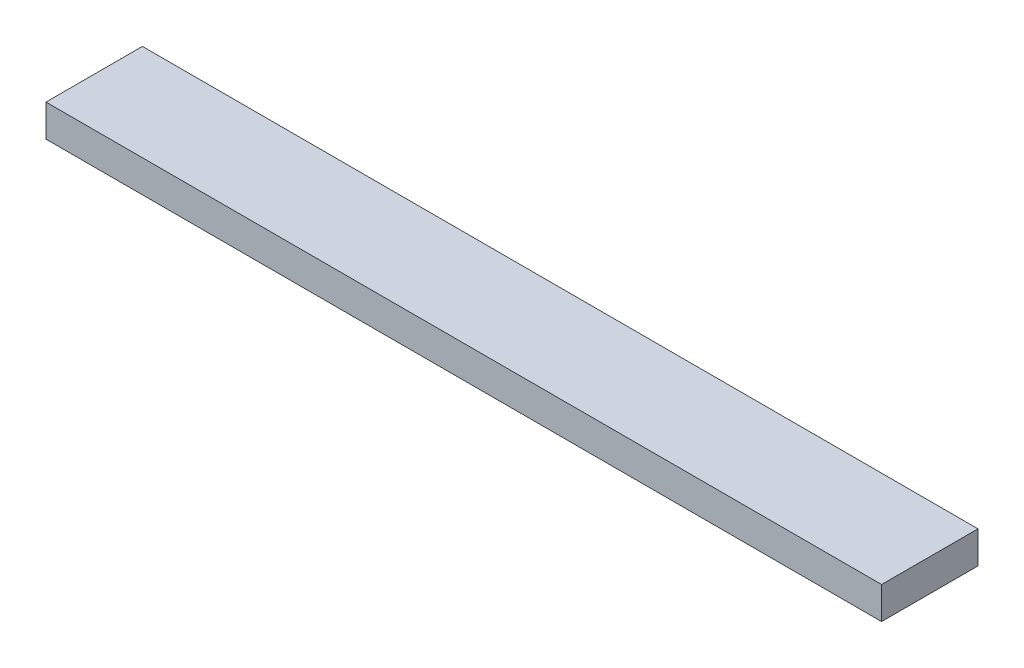
ISO-10303-21;
HEADER;
FILE_DESCRIPTION(('STEP AP214'),'2;1');
FILE_NAME('part.step','',(''),(''),'','','');
FILE_SCHEMA(('AUTOMOTIVE_DESIGN { 1 0 10303 214 1 1 1 1 }'));
ENDSEC;
DATA;
#1=APPLICATION_CONTEXT('core data for automotive mechanical design processes');
#2=APPLICATION_PROTOCOL_DEFINITION('international standard','automotive_design',2000,#1);
#3=PRODUCT_CONTEXT('',#1,'mechanical');
#4=PRODUCT('Part','Part','',(#3));
#5=PRODUCT_RELATED_PRODUCT_CATEGORY('part','',(#4));
#6=PRODUCT_DEFINITION_FORMATION('','',#4);
#7=PRODUCT_DEFINITION_CONTEXT('part definition',#1,'design');
#8=PRODUCT_DEFINITION('design','',#6,#7);
#9=PRODUCT_DEFINITION_SHAPE('','',#8);
#10=(LENGTH_UNIT() NAMED_UNIT(*) SI_UNIT(.MILLI.,.METRE.));
#11=(NAMED_UNIT(*) PLANE_ANGLE_UNIT() SI_UNIT($,.RADIAN.));
#12=(NAMED_UNIT(*) SI_UNIT($,.STERADIAN.) SOLID_ANGLE_UNIT());
#13=UNCERTAINTY_MEASURE_WITH_UNIT(LENGTH_MEASURE(1.E-05),#10,'distance_accuracy_value','');
#14=(GEOMETRIC_REPRESENTATION_CONTEXT(3) GLOBAL_UNCERTAINTY_ASSIGNED_CONTEXT((#13)) GLOBAL_UNIT_ASSIGNED_CONTEXT((#10,
#11,#12)) REPRESENTATION_CONTEXT('',''));
#15=CARTESIAN_POINT('',(0.,0.,0.));
#16=DIRECTION('',(0.,0.,1.));
#17=DIRECTION('',(1.,0.,0.));
#18=AXIS2_PLACEMENT_3D('',#15,#16,#17);
#19=CARTESIAN_POINT('',(82.55,3.175,-9.525));
#20=DIRECTION('',(0.,0.,1.));
#21=DIRECTION('',(1.,0.,0.));
#22=AXIS2_PLACEMENT_3D('',#19,#20,#21);
#23=PLANE('',#22);
#24=DIRECTION('',(0.,1.,0.));
#25=VECTOR('',#24,1.);
#26=CARTESIAN_POINT('',(-82.55,3.175,-9.525));
#27=LINE('',#26,#25);
#28=CARTESIAN_POINT('',(-82.55,-3.175,-9.525));
#29=VERTEX_POINT('',#28);
#30=CARTESIAN_POINT('',(-82.55,3.175,-9.525));
#31=VERTEX_POINT('',#30);
#32=EDGE_CURVE('E107',#29,#31,#27,.T.);
#33=ORIENTED_EDGE('',*,*,#32,.T.);
#34=DIRECTION('',(-1.,0.,0.));
#35=VECTOR('',#34,1.);
#36=CARTESIAN_POINT('',(82.55,3.175,-9.525));
#37=LINE('',#36,#35);
#38=CARTESIAN_POINT('',(82.55,3.175,-9.525));
#39=VERTEX_POINT('',#38);
#40=EDGE_CURVE('E11',#39,#31,#37,.T.);
#41=ORIENTED_EDGE('',*,*,#40,.F.);
#42=DIRECTION('',(0.,1.,0.));
#43=VECTOR('',#42,1.);
#44=CARTESIAN_POINT('',(82.55,3.175,-9.525));
#45=LINE('',#44,#43);
#46=CARTESIAN_POINT('',(82.55,-3.175,-9.525));
#47=VERTEX_POINT('',#46);
#48=EDGE_CURVE('E90',#47,#39,#45,.T.);
#49=ORIENTED_EDGE('',*,*,#48,.F.);
#50=DIRECTION('',(-1.,0.,0.));
#51=VECTOR('',#50,1.);
#52=CARTESIAN_POINT('',(82.55,-3.175,-9.525));
#53=LINE('',#52,#51);
#54=EDGE_CURVE('E103',#47,#29,#53,.T.);
#55=ORIENTED_EDGE('',*,*,#54,.T.);
#56=EDGE_LOOP('',(#33,#41,#49,#55));
#57=FACE_BOUND('',#56,.T.);
#58=ADVANCED_FACE('F38',(#57),#23,.F.);
#59=CARTESIAN_POINT('',(82.55,3.175,9.525));
#60=DIRECTION('',(0.,-1.,0.));
#61=DIRECTION('',(0.,0.,-1.));
#62=AXIS2_PLACEMENT_3D('',#59,#60,#61);
#63=PLANE('',#62);
#64=DIRECTION('',(0.,0.,1.));
#65=VECTOR('',#64,1.);
#66=CARTESIAN_POINT('',(-82.55,3.175,9.525));
#67=LINE('',#66,#65);
#68=CARTESIAN_POINT('',(-82.55,3.175,9.525));
#69=VERTEX_POINT('',#68);
#70=EDGE_CURVE('E95',#31,#69,#67,.T.);
#71=ORIENTED_EDGE('',*,*,#70,.T.);
#72=DIRECTION('',(-1.,0.,0.));
#73=VECTOR('',#72,1.);
#74=CARTESIAN_POINT('',(82.55,3.175,9.525));
#75=LINE('',#74,#73);
#76=CARTESIAN_POINT('',(82.55,3.175,9.525));
#77=VERTEX_POINT('',#76);
#78=EDGE_CURVE('E47',#77,#69,#75,.T.);
#79=ORIENTED_EDGE('',*,*,#78,.F.);
#80=DIRECTION('',(0.,0.,1.));
#81=VECTOR('',#80,1.);
#82=CARTESIAN_POINT('',(82.55,3.175,9.525));
#83=LINE('',#82,#81);
#84=EDGE_CURVE('E85',#39,#77,#83,.T.);
#85=ORIENTED_EDGE('',*,*,#84,.F.);
#86=ORIENTED_EDGE('',*,*,#40,.T.);
#87=EDGE_LOOP('',(#71,#79,#85,#86));
#88=FACE_BOUND('',#87,.T.);
#89=ADVANCED_FACE('F94',(#88),#63,.F.);
#90=CARTESIAN_POINT('',(82.55,3.175,9.525));
#91=DIRECTION('',(0.,0.,-1.));
#92=DIRECTION('',(-1.,0.,0.));
#93=AXIS2_PLACEMENT_3D('',#90,#91,#92);
#94=PLANE('',#93);
#95=DIRECTION('',(0.,-1.,0.));
#96=VECTOR('',#95,1.);
#97=CARTESIAN_POINT('',(-82.55,3.175,9.525));
#98=LINE('',#97,#96);
#99=CARTESIAN_POINT('',(-82.55,-3.175,9.525));
#100=VERTEX_POINT('',#99);
#101=EDGE_CURVE('E72',#69,#100,#98,.T.);
#102=ORIENTED_EDGE('',*,*,#101,.T.);
#103=DIRECTION('',(-1.,0.,0.));
#104=VECTOR('',#103,1.);
#105=CARTESIAN_POINT('',(82.55,-3.175,9.525));
#106=LINE('',#105,#104);
#107=CARTESIAN_POINT('',(82.55,-3.175,9.525));
#108=VERTEX_POINT('',#107);
#109=EDGE_CURVE('E97',#108,#100,#106,.T.);
#110=ORIENTED_EDGE('',*,*,#109,.F.);
#111=DIRECTION('',(0.,-1.,0.));
#112=VECTOR('',#111,1.);
#113=CARTESIAN_POINT('',(82.55,3.175,9.525));
#114=LINE('',#113,#112);
#115=EDGE_CURVE('E88',#77,#108,#114,.T.);
#116=ORIENTED_EDGE('',*,*,#115,.F.);
#117=ORIENTED_EDGE('',*,*,#78,.T.);
#118=EDGE_LOOP('',(#102,#110,#116,#117));
#119=FACE_BOUND('',#118,.T.);
#120=ADVANCED_FACE('F98',(#119),#94,.F.);
#121=CARTESIAN_POINT('',(82.55,-3.175,9.525));
#122=DIRECTION('',(0.,1.,0.));
#123=DIRECTION('',(0.,0.,1.));
#124=AXIS2_PLACEMENT_3D('',#121,#122,#123);
#125=PLANE('',#124);
#126=DIRECTION('',(0.,0.,-1.));
#127=VECTOR('',#126,1.);
#128=CARTESIAN_POINT('',(-82.55,-3.175,9.525));
#129=LINE('',#128,#127);
#130=EDGE_CURVE('E78',#100,#29,#129,.T.);
#131=ORIENTED_EDGE('',*,*,#130,.T.);
#132=ORIENTED_EDGE('',*,*,#54,.F.);
#133=DIRECTION('',(0.,0.,-1.));
#134=VECTOR('',#133,1.);
#135=CARTESIAN_POINT('',(82.55,-3.175,9.525));
#136=LINE('',#135,#134);
#137=EDGE_CURVE('E55',#108,#47,#136,.T.);
#138=ORIENTED_EDGE('',*,*,#137,.F.);
#139=ORIENTED_EDGE('',*,*,#109,.T.);
#140=EDGE_LOOP('',(#131,#132,#138,#139));
#141=FACE_BOUND('',#140,.T.);
#142=ADVANCED_FACE('F121',(#141),#125,.F.);
#143=CARTESIAN_POINT('',(82.55,0.,0.));
#144=DIRECTION('',(1.,0.,0.));
#145=DIRECTION('',(0.,0.,-1.));
#146=AXIS2_PLACEMENT_3D('',#143,#144,#145);
#147=PLANE('',#146);
#148=ORIENTED_EDGE('',*,*,#48,.T.);
#149=ORIENTED_EDGE('',*,*,#84,.T.);
#150=ORIENTED_EDGE('',*,*,#115,.T.);
#151=ORIENTED_EDGE('',*,*,#137,.T.);
#152=EDGE_LOOP('',(#148,#149,#150,#151));
#153=FACE_BOUND('',#152,.T.);
#154=ADVANCED_FACE('F86',(#153),#147,.T.);
#155=CARTESIAN_POINT('',(-82.55,0.,0.));
#156=DIRECTION('',(1.,0.,0.));
#157=DIRECTION('',(0.,0.,-1.));
#158=AXIS2_PLACEMENT_3D('',#155,#156,#157);
#159=PLANE('',#158);
#160=ORIENTED_EDGE('',*,*,#32,.F.);
#161=ORIENTED_EDGE('',*,*,#130,.F.);
#162=ORIENTED_EDGE('',*,*,#101,.F.);
#163=ORIENTED_EDGE('',*,*,#70,.F.);
#164=EDGE_LOOP('',(#160,#161,#162,#163));
#165=FACE_BOUND('',#164,.T.);
#166=ADVANCED_FACE('F124',(#165),#159,.F.);
#167=CLOSED_SHELL('',(#58,#89,#120,#142,#154,#166));
#168=MANIFOLD_SOLID_BREP('B2',#167);
#169=ADVANCED_BREP_SHAPE_REPRESENTATION('',(#18,#168),#14);
#170=SHAPE_DEFINITION_REPRESENTATION(#9,#169);
ENDSEC;
END-ISO-10303-21;
